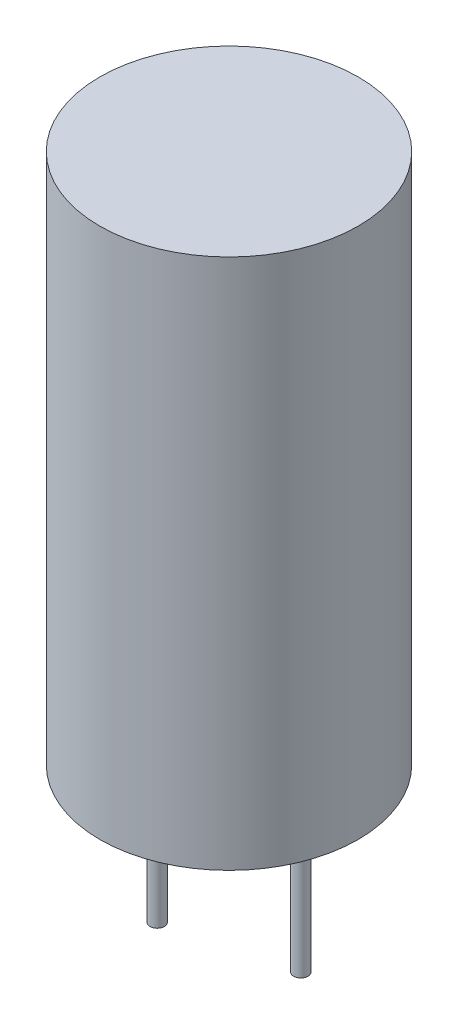
ISO-10303-21;
HEADER;
FILE_DESCRIPTION(('STEP AP214'),'2;1');
FILE_NAME('part.step','',(''),(''),'','','');
FILE_SCHEMA(('AUTOMOTIVE_DESIGN { 1 0 10303 214 1 1 1 1 }'));
ENDSEC;
DATA;
#1=APPLICATION_CONTEXT('core data for automotive mechanical design processes');
#2=APPLICATION_PROTOCOL_DEFINITION('international standard','automotive_design',2000,#1);
#3=PRODUCT_CONTEXT('',#1,'mechanical');
#4=PRODUCT('Part','Part','',(#3));
#5=PRODUCT_RELATED_PRODUCT_CATEGORY('part','',(#4));
#6=PRODUCT_DEFINITION_FORMATION('','',#4);
#7=PRODUCT_DEFINITION_CONTEXT('part definition',#1,'design');
#8=PRODUCT_DEFINITION('design','',#6,#7);
#9=PRODUCT_DEFINITION_SHAPE('','',#8);
#10=(LENGTH_UNIT() NAMED_UNIT(*) SI_UNIT(.MILLI.,.METRE.));
#11=(NAMED_UNIT(*) PLANE_ANGLE_UNIT() SI_UNIT($,.RADIAN.));
#12=(NAMED_UNIT(*) SI_UNIT($,.STERADIAN.) SOLID_ANGLE_UNIT());
#13=UNCERTAINTY_MEASURE_WITH_UNIT(LENGTH_MEASURE(1.E-05),#10,'distance_accuracy_value','');
#14=(GEOMETRIC_REPRESENTATION_CONTEXT(3) GLOBAL_UNCERTAINTY_ASSIGNED_CONTEXT((#13)) GLOBAL_UNIT_ASSIGNED_CONTEXT((#10,
#11,#12)) REPRESENTATION_CONTEXT('',''));
#15=CARTESIAN_POINT('',(0.,0.,0.));
#16=DIRECTION('',(0.,0.,1.));
#17=DIRECTION('',(1.,0.,0.));
#18=AXIS2_PLACEMENT_3D('',#15,#16,#17);
#19=CARTESIAN_POINT('',(0.,0.,0.));
#20=DIRECTION('',(0.,1.,0.));
#21=DIRECTION('',(0.,0.,1.));
#22=AXIS2_PLACEMENT_3D('',#19,#20,#21);
#23=PLANE('',#22);
#24=CARTESIAN_POINT('',(-5.,0.,0.));
#25=DIRECTION('',(0.,1.,0.));
#26=DIRECTION('',(0.,0.,1.));
#27=AXIS2_PLACEMENT_3D('',#24,#25,#26);
#28=CIRCLE('',#27,0.5);
#29=CARTESIAN_POINT('',(-5.,0.,0.5));
#30=VERTEX_POINT('',#29);
#31=EDGE_CURVE('E38',#30,#30,#28,.F.);
#32=ORIENTED_EDGE('',*,*,#31,.F.);
#33=EDGE_LOOP('',(#32));
#34=FACE_BOUND('',#33,.T.);
#35=CARTESIAN_POINT('',(0.,0.,0.));
#36=DIRECTION('',(0.,1.,0.));
#37=DIRECTION('',(0.,0.,1.));
#38=AXIS2_PLACEMENT_3D('',#35,#36,#37);
#39=CIRCLE('',#38,9.);
#40=CARTESIAN_POINT('',(0.,0.,9.));
#41=VERTEX_POINT('',#40);
#42=EDGE_CURVE('E46',#41,#41,#39,.T.);
#43=ORIENTED_EDGE('',*,*,#42,.F.);
#44=EDGE_LOOP('',(#43));
#45=FACE_BOUND('',#44,.T.);
#46=CARTESIAN_POINT('',(5.,0.,0.));
#47=DIRECTION('',(0.,1.,0.));
#48=DIRECTION('',(0.,0.,1.));
#49=AXIS2_PLACEMENT_3D('',#46,#47,#48);
#50=CIRCLE('',#49,0.500000000000001);
#51=CARTESIAN_POINT('',(5.,0.,0.500000000000001));
#52=VERTEX_POINT('',#51);
#53=EDGE_CURVE('E10',#52,#52,#50,.F.);
#54=ORIENTED_EDGE('',*,*,#53,.F.);
#55=EDGE_LOOP('',(#54));
#56=FACE_BOUND('',#55,.T.);
#57=ADVANCED_FACE('F31',(#34,#45,#56),#23,.F.);
#58=CARTESIAN_POINT('',(0.,37.,0.));
#59=DIRECTION('',(0.,-1.,0.));
#60=DIRECTION('',(0.,0.,-1.));
#61=AXIS2_PLACEMENT_3D('',#58,#59,#60);
#62=CYLINDRICAL_SURFACE('',#61,9.);
#63=CARTESIAN_POINT('',(0.,37.,0.));
#64=DIRECTION('',(0.,1.,0.));
#65=DIRECTION('',(0.,0.,1.));
#66=AXIS2_PLACEMENT_3D('',#63,#64,#65);
#67=CIRCLE('',#66,9.);
#68=CARTESIAN_POINT('',(0.,37.,9.));
#69=VERTEX_POINT('',#68);
#70=EDGE_CURVE('E42',#69,#69,#67,.T.);
#71=ORIENTED_EDGE('',*,*,#70,.F.);
#72=EDGE_LOOP('',(#71));
#73=FACE_BOUND('',#72,.T.);
#74=ORIENTED_EDGE('',*,*,#42,.T.);
#75=EDGE_LOOP('',(#74));
#76=FACE_BOUND('',#75,.T.);
#77=ADVANCED_FACE('F33',(#73,#76),#62,.T.);
#78=CARTESIAN_POINT('',(0.,37.,0.));
#79=DIRECTION('',(0.,1.,0.));
#80=DIRECTION('',(0.,0.,1.));
#81=AXIS2_PLACEMENT_3D('',#78,#79,#80);
#82=PLANE('',#81);
#83=ORIENTED_EDGE('',*,*,#70,.T.);
#84=EDGE_LOOP('',(#83));
#85=FACE_BOUND('',#84,.T.);
#86=ADVANCED_FACE('F77',(#85),#82,.T.);
#87=CARTESIAN_POINT('',(-5.,-12.,0.));
#88=DIRECTION('',(0.,1.,0.));
#89=DIRECTION('',(0.,0.,1.));
#90=AXIS2_PLACEMENT_3D('',#87,#88,#89);
#91=CYLINDRICAL_SURFACE('',#90,0.5);
#92=CARTESIAN_POINT('',(-5.,-12.,0.));
#93=DIRECTION('',(0.,-1.,0.));
#94=DIRECTION('',(0.,0.,-1.));
#95=AXIS2_PLACEMENT_3D('',#92,#93,#94);
#96=CIRCLE('',#95,0.5);
#97=CARTESIAN_POINT('',(-5.,-12.,-0.5));
#98=VERTEX_POINT('',#97);
#99=EDGE_CURVE('E50',#98,#98,#96,.T.);
#100=ORIENTED_EDGE('',*,*,#99,.F.);
#101=EDGE_LOOP('',(#100));
#102=FACE_BOUND('',#101,.T.);
#103=ORIENTED_EDGE('',*,*,#31,.T.);
#104=EDGE_LOOP('',(#103));
#105=FACE_BOUND('',#104,.T.);
#106=ADVANCED_FACE('F69',(#102,#105),#91,.T.);
#107=CARTESIAN_POINT('',(-5.,-12.,0.));
#108=DIRECTION('',(0.,-1.,0.));
#109=DIRECTION('',(0.,0.,-1.));
#110=AXIS2_PLACEMENT_3D('',#107,#108,#109);
#111=PLANE('',#110);
#112=ORIENTED_EDGE('',*,*,#99,.T.);
#113=EDGE_LOOP('',(#112));
#114=FACE_BOUND('',#113,.T.);
#115=ADVANCED_FACE('F62',(#114),#111,.T.);
#116=CARTESIAN_POINT('',(5.,-10.,0.));
#117=DIRECTION('',(0.,1.,0.));
#118=DIRECTION('',(0.,0.,1.));
#119=AXIS2_PLACEMENT_3D('',#116,#117,#118);
#120=CYLINDRICAL_SURFACE('',#119,0.500000000000001);
#121=CARTESIAN_POINT('',(5.,-10.,0.));
#122=DIRECTION('',(0.,-1.,0.));
#123=DIRECTION('',(0.,0.,-1.));
#124=AXIS2_PLACEMENT_3D('',#121,#122,#123);
#125=CIRCLE('',#124,0.500000000000001);
#126=CARTESIAN_POINT('',(5.,-10.,-0.500000000000001));
#127=VERTEX_POINT('',#126);
#128=EDGE_CURVE('E54',#127,#127,#125,.T.);
#129=ORIENTED_EDGE('',*,*,#128,.F.);
#130=EDGE_LOOP('',(#129));
#131=FACE_BOUND('',#130,.T.);
#132=ORIENTED_EDGE('',*,*,#53,.T.);
#133=EDGE_LOOP('',(#132));
#134=FACE_BOUND('',#133,.T.);
#135=ADVANCED_FACE('F60',(#131,#134),#120,.T.);
#136=CARTESIAN_POINT('',(5.,-10.,0.));
#137=DIRECTION('',(0.,-1.,0.));
#138=DIRECTION('',(0.,0.,-1.));
#139=AXIS2_PLACEMENT_3D('',#136,#137,#138);
#140=PLANE('',#139);
#141=ORIENTED_EDGE('',*,*,#128,.T.);
#142=EDGE_LOOP('',(#141));
#143=FACE_BOUND('',#142,.T.);
#144=ADVANCED_FACE('F58',(#143),#140,.T.);
#145=CLOSED_SHELL('',(#57,#77,#86,#106,#115,#135,#144));
#146=MANIFOLD_SOLID_BREP('B2',#145);
#147=ADVANCED_BREP_SHAPE_REPRESENTATION('',(#18,#146),#14);
#148=SHAPE_DEFINITION_REPRESENTATION(#9,#147);
ENDSEC;
END-ISO-10303-21;
